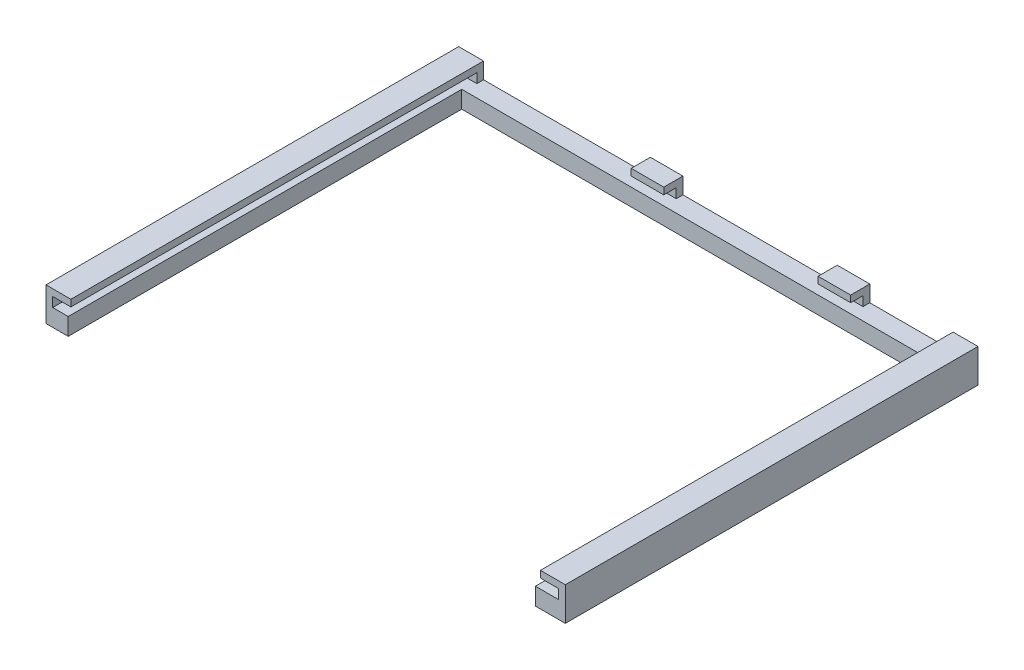
ISO-10303-21;
HEADER;
FILE_DESCRIPTION(('STEP AP214'),'2;1');
FILE_NAME('part.step','',(''),(''),'','','');
FILE_SCHEMA(('AUTOMOTIVE_DESIGN { 1 0 10303 214 1 1 1 1 }'));
ENDSEC;
DATA;
#1=APPLICATION_CONTEXT('core data for automotive mechanical design processes');
#2=APPLICATION_PROTOCOL_DEFINITION('international standard','automotive_design',2000,#1);
#3=PRODUCT_CONTEXT('',#1,'mechanical');
#4=PRODUCT('Part','Part','',(#3));
#5=PRODUCT_RELATED_PRODUCT_CATEGORY('part','',(#4));
#6=PRODUCT_DEFINITION_FORMATION('','',#4);
#7=PRODUCT_DEFINITION_CONTEXT('part definition',#1,'design');
#8=PRODUCT_DEFINITION('design','',#6,#7);
#9=PRODUCT_DEFINITION_SHAPE('','',#8);
#10=(LENGTH_UNIT() NAMED_UNIT(*) SI_UNIT(.MILLI.,.METRE.));
#11=(NAMED_UNIT(*) PLANE_ANGLE_UNIT() SI_UNIT($,.RADIAN.));
#12=(NAMED_UNIT(*) SI_UNIT($,.STERADIAN.) SOLID_ANGLE_UNIT());
#13=UNCERTAINTY_MEASURE_WITH_UNIT(LENGTH_MEASURE(1.E-05),#10,'distance_accuracy_value','');
#14=(GEOMETRIC_REPRESENTATION_CONTEXT(3) GLOBAL_UNCERTAINTY_ASSIGNED_CONTEXT((#13)) GLOBAL_UNIT_ASSIGNED_CONTEXT((#10,
#11,#12)) REPRESENTATION_CONTEXT('',''));
#15=CARTESIAN_POINT('',(0.,0.,0.));
#16=DIRECTION('',(0.,0.,1.));
#17=DIRECTION('',(1.,0.,0.));
#18=AXIS2_PLACEMENT_3D('',#15,#16,#17);
#19=CARTESIAN_POINT('',(0.,0.,0.));
#20=DIRECTION('',(0.,0.,1.));
#21=DIRECTION('',(1.,0.,0.));
#22=AXIS2_PLACEMENT_3D('',#19,#20,#21);
#23=PLANE('',#22);
#24=DIRECTION('',(0.,1.,0.));
#25=VECTOR('',#24,1.);
#26=CARTESIAN_POINT('',(59.9851758888026,0.,0.));
#27=LINE('',#26,#25);
#28=CARTESIAN_POINT('',(59.9851758888026,-31.2089574155654,0.));
#29=VERTEX_POINT('',#28);
#30=CARTESIAN_POINT('',(59.9851758888026,-26.7089574155654,0.));
#31=VERTEX_POINT('',#30);
#32=EDGE_CURVE('E11',#29,#31,#27,.T.);
#33=ORIENTED_EDGE('',*,*,#32,.F.);
#34=DIRECTION('',(1.,0.,0.));
#35=VECTOR('',#34,1.);
#36=CARTESIAN_POINT('',(-67.8,-31.2089574155654,0.));
#37=LINE('',#36,#35);
#38=CARTESIAN_POINT('',(67.8,-31.2089574155654,0.));
#39=VERTEX_POINT('',#38);
#40=EDGE_CURVE('E486',#29,#39,#37,.T.);
#41=ORIENTED_EDGE('',*,*,#40,.T.);
#42=DIRECTION('',(0.,1.,0.));
#43=VECTOR('',#42,1.);
#44=CARTESIAN_POINT('',(67.8,-31.2089574155654,0.));
#45=LINE('',#44,#43);
#46=CARTESIAN_POINT('',(67.8,-22.4589574155654,0.));
#47=VERTEX_POINT('',#46);
#48=EDGE_CURVE('E491',#39,#47,#45,.T.);
#49=ORIENTED_EDGE('',*,*,#48,.T.);
#50=DIRECTION('',(-1.,0.,0.));
#51=VECTOR('',#50,1.);
#52=CARTESIAN_POINT('',(67.8,-22.4589574155654,0.));
#53=LINE('',#52,#51);
#54=CARTESIAN_POINT('',(61.3,-22.4589574155653,0.));
#55=VERTEX_POINT('',#54);
#56=EDGE_CURVE('E495',#47,#55,#53,.T.);
#57=ORIENTED_EDGE('',*,*,#56,.T.);
#58=DIRECTION('',(0.,-1.,0.));
#59=VECTOR('',#58,1.);
#60=CARTESIAN_POINT('',(61.3,-22.4589574155653,0.));
#61=LINE('',#60,#59);
#62=CARTESIAN_POINT('',(61.3,-24.2089574155654,0.));
#63=VERTEX_POINT('',#62);
#64=EDGE_CURVE('E499',#55,#63,#61,.T.);
#65=ORIENTED_EDGE('',*,*,#64,.T.);
#66=DIRECTION('',(1.,0.,0.));
#67=VECTOR('',#66,1.);
#68=CARTESIAN_POINT('',(61.3,-24.2089574155654,0.));
#69=LINE('',#68,#67);
#70=CARTESIAN_POINT('',(66.05,-24.2089574155654,0.));
#71=VERTEX_POINT('',#70);
#72=EDGE_CURVE('E503',#63,#71,#69,.T.);
#73=ORIENTED_EDGE('',*,*,#72,.T.);
#74=DIRECTION('',(0.,-1.,0.));
#75=VECTOR('',#74,1.);
#76=CARTESIAN_POINT('',(66.05,-24.2089574155654,0.));
#77=LINE('',#76,#75);
#78=CARTESIAN_POINT('',(66.05,-26.7089574155654,0.));
#79=VERTEX_POINT('',#78);
#80=EDGE_CURVE('E507',#71,#79,#77,.T.);
#81=ORIENTED_EDGE('',*,*,#80,.T.);
#82=DIRECTION('',(-1.,0.,0.));
#83=VECTOR('',#82,1.);
#84=CARTESIAN_POINT('',(66.05,-26.7089574155654,0.));
#85=LINE('',#84,#83);
#86=EDGE_CURVE('E512',#79,#31,#85,.T.);
#87=ORIENTED_EDGE('',*,*,#86,.T.);
#88=EDGE_LOOP('',(#33,#41,#49,#57,#65,#73,#81,#87));
#89=FACE_BOUND('',#88,.T.);
#90=ADVANCED_FACE('F45',(#89),#23,.T.);
#91=CARTESIAN_POINT('',(66.05,-26.7089574155654,-107.75));
#92=DIRECTION('',(0.,1.,0.));
#93=DIRECTION('',(-1.,0.,0.));
#94=AXIS2_PLACEMENT_3D('',#91,#92,#93);
#95=PLANE('',#94);
#96=DIRECTION('',(0.,0.,1.));
#97=VECTOR('',#96,1.);
#98=CARTESIAN_POINT('',(59.9851758888026,-26.7089574155654,4.1474286698367));
#99=LINE('',#98,#97);
#100=CARTESIAN_POINT('',(59.9851758888026,-26.7089574155654,-102.75));
#101=VERTEX_POINT('',#100);
#102=EDGE_CURVE('E243',#101,#31,#99,.T.);
#103=ORIENTED_EDGE('',*,*,#102,.T.);
#104=ORIENTED_EDGE('',*,*,#86,.F.);
#105=DIRECTION('',(0.,0.,1.));
#106=VECTOR('',#105,1.);
#107=CARTESIAN_POINT('',(66.05,-26.7089574155654,-107.75));
#108=LINE('',#107,#106);
#109=CARTESIAN_POINT('',(66.05,-26.7089574155654,-106.));
#110=VERTEX_POINT('',#109);
#111=EDGE_CURVE('E525',#110,#79,#108,.T.);
#112=ORIENTED_EDGE('',*,*,#111,.F.);
#113=DIRECTION('',(1.,0.,0.));
#114=VECTOR('',#113,1.);
#115=CARTESIAN_POINT('',(58.248361096067,-26.7089574155648,-106.));
#116=LINE('',#115,#114);
#117=CARTESIAN_POINT('',(61.3,-26.7089574155654,-106.));
#118=VERTEX_POINT('',#117);
#119=EDGE_CURVE('E289',#118,#110,#116,.T.);
#120=ORIENTED_EDGE('',*,*,#119,.F.);
#121=DIRECTION('',(0.,0.,1.));
#122=VECTOR('',#121,1.);
#123=CARTESIAN_POINT('',(61.3,-26.7089574155648,-107.75));
#124=LINE('',#123,#122);
#125=CARTESIAN_POINT('',(61.3,-26.7089574155654,-107.75));
#126=VERTEX_POINT('',#125);
#127=EDGE_CURVE('E307',#126,#118,#124,.T.);
#128=ORIENTED_EDGE('',*,*,#127,.F.);
#129=DIRECTION('',(-1.,0.,0.));
#130=VECTOR('',#129,1.);
#131=CARTESIAN_POINT('',(66.05,-26.7089574155654,-107.75));
#132=LINE('',#131,#130);
#133=CARTESIAN_POINT('',(39.55,-26.7089574155654,-107.75));
#134=VERTEX_POINT('',#133);
#135=EDGE_CURVE('E466',#126,#134,#132,.T.);
#136=ORIENTED_EDGE('',*,*,#135,.T.);
#137=DIRECTION('',(0.,0.,-1.));
#138=VECTOR('',#137,1.);
#139=CARTESIAN_POINT('',(39.55,-26.7089574155654,-107.75));
#140=LINE('',#139,#138);
#141=CARTESIAN_POINT('',(39.55,-26.7089574155654,-106.));
#142=VERTEX_POINT('',#141);
#143=EDGE_CURVE('E380',#142,#134,#140,.T.);
#144=ORIENTED_EDGE('',*,*,#143,.F.);
#145=DIRECTION('',(1.,0.,0.));
#146=VECTOR('',#145,1.);
#147=CARTESIAN_POINT('',(31.05,-26.7089574155654,-106.));
#148=LINE('',#147,#146);
#149=CARTESIAN_POINT('',(31.05,-26.7089574155654,-106.));
#150=VERTEX_POINT('',#149);
#151=EDGE_CURVE('E358',#150,#142,#148,.T.);
#152=ORIENTED_EDGE('',*,*,#151,.F.);
#153=DIRECTION('',(0.,0.,1.));
#154=VECTOR('',#153,1.);
#155=CARTESIAN_POINT('',(31.05,-26.7089574155654,-107.75));
#156=LINE('',#155,#154);
#157=CARTESIAN_POINT('',(31.05,-26.7089574155654,-107.75));
#158=VERTEX_POINT('',#157);
#159=EDGE_CURVE('E384',#158,#150,#156,.T.);
#160=ORIENTED_EDGE('',*,*,#159,.F.);
#161=CARTESIAN_POINT('',(-9.24999999999999,-26.7089574155654,-107.75));
#162=VERTEX_POINT('',#161);
#163=EDGE_CURVE('E470',#158,#162,#132,.T.);
#164=ORIENTED_EDGE('',*,*,#163,.T.);
#165=DIRECTION('',(0.,0.,-1.));
#166=VECTOR('',#165,1.);
#167=CARTESIAN_POINT('',(-9.25,-26.7089574155654,-107.75));
#168=LINE('',#167,#166);
#169=CARTESIAN_POINT('',(-9.25,-26.7089574155654,-106.));
#170=VERTEX_POINT('',#169);
#171=EDGE_CURVE('E406',#170,#162,#168,.T.);
#172=ORIENTED_EDGE('',*,*,#171,.F.);
#173=DIRECTION('',(1.,0.,0.));
#174=VECTOR('',#173,1.);
#175=CARTESIAN_POINT('',(-17.75,-26.7089574155654,-106.));
#176=LINE('',#175,#174);
#177=CARTESIAN_POINT('',(-17.75,-26.7089574155654,-106.));
#178=VERTEX_POINT('',#177);
#179=EDGE_CURVE('E320',#178,#170,#176,.T.);
#180=ORIENTED_EDGE('',*,*,#179,.F.);
#181=DIRECTION('',(0.,0.,1.));
#182=VECTOR('',#181,1.);
#183=CARTESIAN_POINT('',(-17.75,-26.7089574155654,-107.75));
#184=LINE('',#183,#182);
#185=CARTESIAN_POINT('',(-17.75,-26.7089574155654,-107.75));
#186=VERTEX_POINT('',#185);
#187=EDGE_CURVE('E389',#186,#178,#184,.T.);
#188=ORIENTED_EDGE('',*,*,#187,.F.);
#189=CARTESIAN_POINT('',(-61.3,-26.7089574155654,-107.75));
#190=VERTEX_POINT('',#189);
#191=EDGE_CURVE('E465',#186,#190,#132,.T.);
#192=ORIENTED_EDGE('',*,*,#191,.T.);
#193=DIRECTION('',(0.,0.,-1.));
#194=VECTOR('',#193,1.);
#195=CARTESIAN_POINT('',(-61.3,-26.7089574155654,-107.75));
#196=LINE('',#195,#194);
#197=CARTESIAN_POINT('',(-61.3,-26.7089574155654,-106.));
#198=VERTEX_POINT('',#197);
#199=EDGE_CURVE('E69',#198,#190,#196,.T.);
#200=ORIENTED_EDGE('',*,*,#199,.F.);
#201=DIRECTION('',(-1.,0.,0.));
#202=VECTOR('',#201,1.);
#203=CARTESIAN_POINT('',(-58.2483610960666,-26.7089574155654,-106.));
#204=LINE('',#203,#202);
#205=CARTESIAN_POINT('',(-66.05,-26.7089574155654,-106.));
#206=VERTEX_POINT('',#205);
#207=EDGE_CURVE('E284',#198,#206,#204,.T.);
#208=ORIENTED_EDGE('',*,*,#207,.T.);
#209=DIRECTION('',(0.,0.,1.));
#210=VECTOR('',#209,1.);
#211=CARTESIAN_POINT('',(-66.05,-26.7089574155654,-107.75));
#212=LINE('',#211,#210);
#213=CARTESIAN_POINT('',(-66.05,-26.7089574155654,0.));
#214=VERTEX_POINT('',#213);
#215=EDGE_CURVE('E521',#206,#214,#212,.T.);
#216=ORIENTED_EDGE('',*,*,#215,.T.);
#217=CARTESIAN_POINT('',(-62.,-26.7089574155654,0.));
#218=VERTEX_POINT('',#217);
#219=EDGE_CURVE('E511',#218,#214,#85,.T.);
#220=ORIENTED_EDGE('',*,*,#219,.F.);
#221=DIRECTION('',(0.,0.,-1.));
#222=VECTOR('',#221,1.);
#223=CARTESIAN_POINT('',(-62.,-26.7089574155654,4.1474286698367));
#224=LINE('',#223,#222);
#225=CARTESIAN_POINT('',(-62.,-26.7089574155654,-102.75));
#226=VERTEX_POINT('',#225);
#227=EDGE_CURVE('E61',#218,#226,#224,.T.);
#228=ORIENTED_EDGE('',*,*,#227,.T.);
#229=DIRECTION('',(1.,0.,0.));
#230=VECTOR('',#229,1.);
#231=CARTESIAN_POINT('',(-62.,-26.7089574155654,-102.75));
#232=LINE('',#231,#230);
#233=EDGE_CURVE('E257',#226,#101,#232,.T.);
#234=ORIENTED_EDGE('',*,*,#233,.T.);
#235=EDGE_LOOP('',(#103,#104,#112,#120,#128,#136,#144,#152,#160,#164,#172,#180,#188,#192,#200,
#208,#216,#220,#228,#234));
#236=FACE_BOUND('',#235,.T.);
#237=ADVANCED_FACE('F263',(#236),#95,.T.);
#238=CARTESIAN_POINT('',(-66.05,-24.2089574155654,-107.75));
#239=DIRECTION('',(0.,-1.,0.));
#240=DIRECTION('',(0.,0.,-1.));
#241=AXIS2_PLACEMENT_3D('',#238,#239,#240);
#242=PLANE('',#241);
#243=DIRECTION('',(0.,0.,1.));
#244=VECTOR('',#243,1.);
#245=CARTESIAN_POINT('',(-66.05,-24.2089574155654,-107.75));
#246=LINE('',#245,#244);
#247=CARTESIAN_POINT('',(-66.05,-24.2089574155654,-106.));
#248=VERTEX_POINT('',#247);
#249=CARTESIAN_POINT('',(-66.05,-24.2089574155654,0.));
#250=VERTEX_POINT('',#249);
#251=EDGE_CURVE('E518',#248,#250,#246,.T.);
#252=ORIENTED_EDGE('',*,*,#251,.F.);
#253=DIRECTION('',(-1.,0.,0.));
#254=VECTOR('',#253,1.);
#255=CARTESIAN_POINT('',(-58.2483610960666,-24.2089574155654,-106.));
#256=LINE('',#255,#254);
#257=CARTESIAN_POINT('',(-61.3,-24.2089574155654,-106.));
#258=VERTEX_POINT('',#257);
#259=EDGE_CURVE('E279',#258,#248,#256,.T.);
#260=ORIENTED_EDGE('',*,*,#259,.F.);
#261=DIRECTION('',(0.,0.,1.));
#262=VECTOR('',#261,1.);
#263=CARTESIAN_POINT('',(-61.3,-24.2089574155654,-107.75));
#264=LINE('',#263,#262);
#265=CARTESIAN_POINT('',(-61.3,-24.2089574155654,0.));
#266=VERTEX_POINT('',#265);
#267=EDGE_CURVE('E469',#258,#266,#264,.T.);
#268=ORIENTED_EDGE('',*,*,#267,.T.);
#269=DIRECTION('',(1.,0.,0.));
#270=VECTOR('',#269,1.);
#271=CARTESIAN_POINT('',(-66.05,-24.2089574155654,0.));
#272=LINE('',#271,#270);
#273=EDGE_CURVE('E436',#250,#266,#272,.T.);
#274=ORIENTED_EDGE('',*,*,#273,.F.);
#275=EDGE_LOOP('',(#252,#260,#268,#274));
#276=FACE_BOUND('',#275,.T.);
#277=ADVANCED_FACE('F47',(#276),#242,.T.);
#278=CARTESIAN_POINT('',(-66.05,-26.7089574155654,-107.75));
#279=DIRECTION('',(1.,0.,0.));
#280=DIRECTION('',(0.,0.,-1.));
#281=AXIS2_PLACEMENT_3D('',#278,#279,#280);
#282=PLANE('',#281);
#283=ORIENTED_EDGE('',*,*,#215,.F.);
#284=DIRECTION('',(0.,-1.,0.));
#285=VECTOR('',#284,1.);
#286=CARTESIAN_POINT('',(-66.05,-26.7089574155654,-106.));
#287=LINE('',#286,#285);
#288=EDGE_CURVE('E280',#248,#206,#287,.T.);
#289=ORIENTED_EDGE('',*,*,#288,.F.);
#290=ORIENTED_EDGE('',*,*,#251,.T.);
#291=DIRECTION('',(0.,1.,0.));
#292=VECTOR('',#291,1.);
#293=CARTESIAN_POINT('',(-66.05,-26.7089574155654,0.));
#294=LINE('',#293,#292);
#295=EDGE_CURVE('E442',#214,#250,#294,.T.);
#296=ORIENTED_EDGE('',*,*,#295,.F.);
#297=EDGE_LOOP('',(#283,#289,#290,#296));
#298=FACE_BOUND('',#297,.T.);
#299=ADVANCED_FACE('F624',(#298),#282,.T.);
#300=CARTESIAN_POINT('',(66.05,-24.2089574155654,-107.75));
#301=DIRECTION('',(-1.,0.,0.));
#302=DIRECTION('',(0.,0.,1.));
#303=AXIS2_PLACEMENT_3D('',#300,#301,#302);
#304=PLANE('',#303);
#305=DIRECTION('',(0.,0.,1.));
#306=VECTOR('',#305,1.);
#307=CARTESIAN_POINT('',(66.05,-24.2089574155654,-107.75));
#308=LINE('',#307,#306);
#309=CARTESIAN_POINT('',(66.05,-24.2089574155654,-106.));
#310=VERTEX_POINT('',#309);
#311=EDGE_CURVE('E528',#310,#71,#308,.T.);
#312=ORIENTED_EDGE('',*,*,#311,.F.);
#313=DIRECTION('',(0.,1.,0.));
#314=VECTOR('',#313,1.);
#315=CARTESIAN_POINT('',(66.0499999999998,-26.7089574155648,-106.));
#316=LINE('',#315,#314);
#317=EDGE_CURVE('E297',#110,#310,#316,.T.);
#318=ORIENTED_EDGE('',*,*,#317,.F.);
#319=ORIENTED_EDGE('',*,*,#111,.T.);
#320=ORIENTED_EDGE('',*,*,#80,.F.);
#321=EDGE_LOOP('',(#312,#318,#319,#320));
#322=FACE_BOUND('',#321,.T.);
#323=ADVANCED_FACE('F853',(#322),#304,.T.);
#324=CARTESIAN_POINT('',(61.3,-24.2089574155654,-107.75));
#325=DIRECTION('',(0.,-1.,0.));
#326=DIRECTION('',(1.,0.,0.));
#327=AXIS2_PLACEMENT_3D('',#324,#325,#326);
#328=PLANE('',#327);
#329=DIRECTION('',(0.,0.,1.));
#330=VECTOR('',#329,1.);
#331=CARTESIAN_POINT('',(61.3,-24.2089574155654,-107.75));
#332=LINE('',#331,#330);
#333=CARTESIAN_POINT('',(61.3,-24.2089574155654,-106.));
#334=VERTEX_POINT('',#333);
#335=EDGE_CURVE('E531',#334,#63,#332,.T.);
#336=ORIENTED_EDGE('',*,*,#335,.F.);
#337=DIRECTION('',(1.,0.,0.));
#338=VECTOR('',#337,1.);
#339=CARTESIAN_POINT('',(58.248361096067,-24.2089574155653,-106.));
#340=LINE('',#339,#338);
#341=EDGE_CURVE('E301',#334,#310,#340,.T.);
#342=ORIENTED_EDGE('',*,*,#341,.T.);
#343=ORIENTED_EDGE('',*,*,#311,.T.);
#344=ORIENTED_EDGE('',*,*,#72,.F.);
#345=EDGE_LOOP('',(#336,#342,#343,#344));
#346=FACE_BOUND('',#345,.T.);
#347=ADVANCED_FACE('F848',(#346),#328,.T.);
#348=CARTESIAN_POINT('',(61.3,-22.4589574155653,-107.75));
#349=DIRECTION('',(-1.,0.,0.));
#350=DIRECTION('',(0.,0.,1.));
#351=AXIS2_PLACEMENT_3D('',#348,#349,#350);
#352=PLANE('',#351);
#353=ORIENTED_EDGE('',*,*,#64,.F.);
#354=DIRECTION('',(0.,0.,1.));
#355=VECTOR('',#354,1.);
#356=CARTESIAN_POINT('',(61.3,-22.4589574155653,-107.75));
#357=LINE('',#356,#355);
#358=CARTESIAN_POINT('',(61.3,-22.4589574155653,-107.75));
#359=VERTEX_POINT('',#358);
#360=EDGE_CURVE('E534',#359,#55,#357,.T.);
#361=ORIENTED_EDGE('',*,*,#360,.F.);
#362=DIRECTION('',(0.,-1.,0.));
#363=VECTOR('',#362,1.);
#364=CARTESIAN_POINT('',(61.3,-22.4589574155653,-107.75));
#365=LINE('',#364,#363);
#366=EDGE_CURVE('E462',#359,#126,#365,.T.);
#367=ORIENTED_EDGE('',*,*,#366,.T.);
#368=ORIENTED_EDGE('',*,*,#127,.T.);
#369=DIRECTION('',(0.,1.,0.));
#370=VECTOR('',#369,1.);
#371=CARTESIAN_POINT('',(61.3,-26.7089574155648,-106.));
#372=LINE('',#371,#370);
#373=EDGE_CURVE('E302',#118,#334,#372,.T.);
#374=ORIENTED_EDGE('',*,*,#373,.T.);
#375=ORIENTED_EDGE('',*,*,#335,.T.);
#376=EDGE_LOOP('',(#353,#361,#367,#368,#374,#375));
#377=FACE_BOUND('',#376,.T.);
#378=ADVANCED_FACE('F852',(#377),#352,.T.);
#379=CARTESIAN_POINT('',(67.8,-22.4589574155654,-107.75));
#380=DIRECTION('',(0.,1.,0.));
#381=DIRECTION('',(-1.,0.,0.));
#382=AXIS2_PLACEMENT_3D('',#379,#380,#381);
#383=PLANE('',#382);
#384=ORIENTED_EDGE('',*,*,#56,.F.);
#385=DIRECTION('',(0.,0.,1.));
#386=VECTOR('',#385,1.);
#387=CARTESIAN_POINT('',(67.8,-22.4589574155654,-107.75));
#388=LINE('',#387,#386);
#389=CARTESIAN_POINT('',(67.8,-22.4589574155654,-107.75));
#390=VERTEX_POINT('',#389);
#391=EDGE_CURVE('E537',#390,#47,#388,.T.);
#392=ORIENTED_EDGE('',*,*,#391,.F.);
#393=DIRECTION('',(-1.,0.,0.));
#394=VECTOR('',#393,1.);
#395=CARTESIAN_POINT('',(67.8,-22.4589574155654,-107.75));
#396=LINE('',#395,#394);
#397=EDGE_CURVE('E458',#390,#359,#396,.T.);
#398=ORIENTED_EDGE('',*,*,#397,.T.);
#399=ORIENTED_EDGE('',*,*,#360,.T.);
#400=EDGE_LOOP('',(#384,#392,#398,#399));
#401=FACE_BOUND('',#400,.T.);
#402=ADVANCED_FACE('F890',(#401),#383,.T.);
#403=CARTESIAN_POINT('',(67.8,-31.2089574155654,-107.75));
#404=DIRECTION('',(1.,0.,0.));
#405=DIRECTION('',(0.,0.,-1.));
#406=AXIS2_PLACEMENT_3D('',#403,#404,#405);
#407=PLANE('',#406);
#408=ORIENTED_EDGE('',*,*,#48,.F.);
#409=DIRECTION('',(0.,0.,1.));
#410=VECTOR('',#409,1.);
#411=CARTESIAN_POINT('',(67.8,-31.2089574155654,-107.75));
#412=LINE('',#411,#410);
#413=CARTESIAN_POINT('',(67.8,-31.2089574155654,-107.75));
#414=VERTEX_POINT('',#413);
#415=EDGE_CURVE('E540',#414,#39,#412,.T.);
#416=ORIENTED_EDGE('',*,*,#415,.F.);
#417=DIRECTION('',(0.,1.,0.));
#418=VECTOR('',#417,1.);
#419=CARTESIAN_POINT('',(67.8,-31.2089574155654,-107.75));
#420=LINE('',#419,#418);
#421=EDGE_CURVE('E454',#414,#390,#420,.T.);
#422=ORIENTED_EDGE('',*,*,#421,.T.);
#423=ORIENTED_EDGE('',*,*,#391,.T.);
#424=EDGE_LOOP('',(#408,#416,#422,#423));
#425=FACE_BOUND('',#424,.T.);
#426=ADVANCED_FACE('F577',(#425),#407,.T.);
#427=CARTESIAN_POINT('',(-67.8,-31.2089574155654,-107.75));
#428=DIRECTION('',(0.,-1.,0.));
#429=DIRECTION('',(0.,0.,-1.));
#430=AXIS2_PLACEMENT_3D('',#427,#428,#429);
#431=PLANE('',#430);
#432=DIRECTION('',(0.,0.,1.));
#433=VECTOR('',#432,1.);
#434=CARTESIAN_POINT('',(59.9851758888026,-31.2089574155654,4.1474286698367));
#435=LINE('',#434,#433);
#436=CARTESIAN_POINT('',(59.9851758888026,-31.2089574155654,-102.75));
#437=VERTEX_POINT('',#436);
#438=EDGE_CURVE('E266',#437,#29,#435,.T.);
#439=ORIENTED_EDGE('',*,*,#438,.F.);
#440=DIRECTION('',(1.,0.,0.));
#441=VECTOR('',#440,1.);
#442=CARTESIAN_POINT('',(-62.,-31.2089574155654,-102.75));
#443=LINE('',#442,#441);
#444=CARTESIAN_POINT('',(-62.,-31.2089574155654,-102.75));
#445=VERTEX_POINT('',#444);
#446=EDGE_CURVE('E259',#445,#437,#443,.T.);
#447=ORIENTED_EDGE('',*,*,#446,.F.);
#448=DIRECTION('',(0.,0.,-1.));
#449=VECTOR('',#448,1.);
#450=CARTESIAN_POINT('',(-62.,-31.2089574155654,4.1474286698367));
#451=LINE('',#450,#449);
#452=CARTESIAN_POINT('',(-62.,-31.2089574155654,0.));
#453=VERTEX_POINT('',#452);
#454=EDGE_CURVE('E272',#453,#445,#451,.T.);
#455=ORIENTED_EDGE('',*,*,#454,.F.);
#456=CARTESIAN_POINT('',(-67.8,-31.2089574155654,0.));
#457=VERTEX_POINT('',#456);
#458=EDGE_CURVE('E487',#457,#453,#37,.T.);
#459=ORIENTED_EDGE('',*,*,#458,.F.);
#460=DIRECTION('',(0.,0.,1.));
#461=VECTOR('',#460,1.);
#462=CARTESIAN_POINT('',(-67.8,-31.2089574155654,-107.75));
#463=LINE('',#462,#461);
#464=CARTESIAN_POINT('',(-67.8,-31.2089574155654,-107.75));
#465=VERTEX_POINT('',#464);
#466=EDGE_CURVE('E544',#465,#457,#463,.T.);
#467=ORIENTED_EDGE('',*,*,#466,.F.);
#468=DIRECTION('',(1.,0.,0.));
#469=VECTOR('',#468,1.);
#470=CARTESIAN_POINT('',(-67.8,-31.2089574155654,-107.75));
#471=LINE('',#470,#469);
#472=EDGE_CURVE('E450',#465,#414,#471,.T.);
#473=ORIENTED_EDGE('',*,*,#472,.T.);
#474=ORIENTED_EDGE('',*,*,#415,.T.);
#475=ORIENTED_EDGE('',*,*,#40,.F.);
#476=EDGE_LOOP('',(#439,#447,#455,#459,#467,#473,#474,#475));
#477=FACE_BOUND('',#476,.T.);
#478=ADVANCED_FACE('F560',(#477),#431,.T.);
#479=CARTESIAN_POINT('',(-67.8,-22.4589574155654,-107.75));
#480=DIRECTION('',(-1.,0.,0.));
#481=DIRECTION('',(0.,0.,1.));
#482=AXIS2_PLACEMENT_3D('',#479,#480,#481);
#483=PLANE('',#482);
#484=DIRECTION('',(0.,-1.,0.));
#485=VECTOR('',#484,1.);
#486=CARTESIAN_POINT('',(-67.8,-22.4589574155654,0.));
#487=LINE('',#486,#485);
#488=CARTESIAN_POINT('',(-67.8,-22.4589574155654,0.));
#489=VERTEX_POINT('',#488);
#490=EDGE_CURVE('E482',#489,#457,#487,.T.);
#491=ORIENTED_EDGE('',*,*,#490,.F.);
#492=DIRECTION('',(0.,0.,1.));
#493=VECTOR('',#492,1.);
#494=CARTESIAN_POINT('',(-67.8,-22.4589574155654,-107.75));
#495=LINE('',#494,#493);
#496=CARTESIAN_POINT('',(-67.8,-22.4589574155654,-107.75));
#497=VERTEX_POINT('',#496);
#498=EDGE_CURVE('E547',#497,#489,#495,.T.);
#499=ORIENTED_EDGE('',*,*,#498,.F.);
#500=DIRECTION('',(0.,-1.,0.));
#501=VECTOR('',#500,1.);
#502=CARTESIAN_POINT('',(-67.8,-22.4589574155654,-107.75));
#503=LINE('',#502,#501);
#504=EDGE_CURVE('E446',#497,#465,#503,.T.);
#505=ORIENTED_EDGE('',*,*,#504,.T.);
#506=ORIENTED_EDGE('',*,*,#466,.T.);
#507=EDGE_LOOP('',(#491,#499,#505,#506));
#508=FACE_BOUND('',#507,.T.);
#509=ADVANCED_FACE('F566',(#508),#483,.T.);
#510=CARTESIAN_POINT('',(-61.3,-22.4589574155653,-107.75));
#511=DIRECTION('',(0.,1.,0.));
#512=DIRECTION('',(-1.,0.,0.));
#513=AXIS2_PLACEMENT_3D('',#510,#511,#512);
#514=PLANE('',#513);
#515=DIRECTION('',(-1.,0.,0.));
#516=VECTOR('',#515,1.);
#517=CARTESIAN_POINT('',(-61.3,-22.4589574155653,0.));
#518=LINE('',#517,#516);
#519=CARTESIAN_POINT('',(-61.3,-22.4589574155653,0.));
#520=VERTEX_POINT('',#519);
#521=EDGE_CURVE('E478',#520,#489,#518,.T.);
#522=ORIENTED_EDGE('',*,*,#521,.F.);
#523=DIRECTION('',(0.,0.,1.));
#524=VECTOR('',#523,1.);
#525=CARTESIAN_POINT('',(-61.3,-22.4589574155653,-107.75));
#526=LINE('',#525,#524);
#527=CARTESIAN_POINT('',(-61.3,-22.4589574155653,-107.75));
#528=VERTEX_POINT('',#527);
#529=EDGE_CURVE('E550',#528,#520,#526,.T.);
#530=ORIENTED_EDGE('',*,*,#529,.F.);
#531=DIRECTION('',(-1.,0.,0.));
#532=VECTOR('',#531,1.);
#533=CARTESIAN_POINT('',(-61.3,-22.4589574155653,-107.75));
#534=LINE('',#533,#532);
#535=EDGE_CURVE('E441',#528,#497,#534,.T.);
#536=ORIENTED_EDGE('',*,*,#535,.T.);
#537=ORIENTED_EDGE('',*,*,#498,.T.);
#538=EDGE_LOOP('',(#522,#530,#536,#537));
#539=FACE_BOUND('',#538,.T.);
#540=ADVANCED_FACE('F629',(#539),#514,.T.);
#541=CARTESIAN_POINT('',(-61.3,-24.2089574155654,-107.75));
#542=DIRECTION('',(1.,0.,0.));
#543=DIRECTION('',(0.,1.,0.));
#544=AXIS2_PLACEMENT_3D('',#541,#542,#543);
#545=PLANE('',#544);
#546=DIRECTION('',(0.,1.,0.));
#547=VECTOR('',#546,1.);
#548=CARTESIAN_POINT('',(-61.3,-24.2089574155654,0.));
#549=LINE('',#548,#547);
#550=EDGE_CURVE('E474',#266,#520,#549,.T.);
#551=ORIENTED_EDGE('',*,*,#550,.F.);
#552=ORIENTED_EDGE('',*,*,#267,.F.);
#553=DIRECTION('',(0.,-1.,0.));
#554=VECTOR('',#553,1.);
#555=CARTESIAN_POINT('',(-61.3,-26.7089574155653,-106.));
#556=LINE('',#555,#554);
#557=EDGE_CURVE('E285',#258,#198,#556,.T.);
#558=ORIENTED_EDGE('',*,*,#557,.T.);
#559=ORIENTED_EDGE('',*,*,#199,.T.);
#560=DIRECTION('',(0.,1.,0.));
#561=VECTOR('',#560,1.);
#562=CARTESIAN_POINT('',(-61.3,-24.2089574155654,-107.75));
#563=LINE('',#562,#561);
#564=EDGE_CURVE('E437',#190,#528,#563,.T.);
#565=ORIENTED_EDGE('',*,*,#564,.T.);
#566=ORIENTED_EDGE('',*,*,#529,.T.);
#567=EDGE_LOOP('',(#551,#552,#558,#559,#565,#566));
#568=FACE_BOUND('',#567,.T.);
#569=ADVANCED_FACE('F616',(#568),#545,.T.);
#570=CARTESIAN_POINT('',(0.,0.,-107.75));
#571=DIRECTION('',(0.,0.,1.));
#572=DIRECTION('',(1.,0.,0.));
#573=AXIS2_PLACEMENT_3D('',#570,#571,#572);
#574=PLANE('',#573);
#575=ORIENTED_EDGE('',*,*,#564,.F.);
#576=ORIENTED_EDGE('',*,*,#191,.F.);
#577=DIRECTION('',(0.,-1.,0.));
#578=VECTOR('',#577,1.);
#579=CARTESIAN_POINT('',(-17.75,-22.4589574155654,-107.75));
#580=LINE('',#579,#578);
#581=CARTESIAN_POINT('',(-17.75,-22.4589574155654,-107.75));
#582=VERTEX_POINT('',#581);
#583=EDGE_CURVE('E415',#582,#186,#580,.T.);
#584=ORIENTED_EDGE('',*,*,#583,.F.);
#585=DIRECTION('',(-1.,0.,0.));
#586=VECTOR('',#585,1.);
#587=CARTESIAN_POINT('',(-17.75,-22.4589574155654,-107.75));
#588=LINE('',#587,#586);
#589=CARTESIAN_POINT('',(-9.25,-22.4589574155654,-107.75));
#590=VERTEX_POINT('',#589);
#591=EDGE_CURVE('E412',#590,#582,#588,.T.);
#592=ORIENTED_EDGE('',*,*,#591,.F.);
#593=DIRECTION('',(0.,-1.,0.));
#594=VECTOR('',#593,1.);
#595=CARTESIAN_POINT('',(-9.25,-22.4589574155654,-107.75));
#596=LINE('',#595,#594);
#597=EDGE_CURVE('E424',#590,#162,#596,.T.);
#598=ORIENTED_EDGE('',*,*,#597,.T.);
#599=ORIENTED_EDGE('',*,*,#163,.F.);
#600=DIRECTION('',(0.,-1.,0.));
#601=VECTOR('',#600,1.);
#602=CARTESIAN_POINT('',(31.05,-22.4589574155654,-107.75));
#603=LINE('',#602,#601);
#604=CARTESIAN_POINT('',(31.05,-22.4589574155654,-107.75));
#605=VERTEX_POINT('',#604);
#606=EDGE_CURVE('E375',#605,#158,#603,.T.);
#607=ORIENTED_EDGE('',*,*,#606,.F.);
#608=DIRECTION('',(-1.,0.,0.));
#609=VECTOR('',#608,1.);
#610=CARTESIAN_POINT('',(31.05,-22.4589574155654,-107.75));
#611=LINE('',#610,#609);
#612=CARTESIAN_POINT('',(39.55,-22.4589574155654,-107.75));
#613=VERTEX_POINT('',#612);
#614=EDGE_CURVE('E379',#613,#605,#611,.T.);
#615=ORIENTED_EDGE('',*,*,#614,.F.);
#616=DIRECTION('',(0.,-1.,0.));
#617=VECTOR('',#616,1.);
#618=CARTESIAN_POINT('',(39.55,-22.4589574155654,-107.75));
#619=LINE('',#618,#617);
#620=EDGE_CURVE('E371',#613,#134,#619,.T.);
#621=ORIENTED_EDGE('',*,*,#620,.T.);
#622=ORIENTED_EDGE('',*,*,#135,.F.);
#623=ORIENTED_EDGE('',*,*,#366,.F.);
#624=ORIENTED_EDGE('',*,*,#397,.F.);
#625=ORIENTED_EDGE('',*,*,#421,.F.);
#626=ORIENTED_EDGE('',*,*,#472,.F.);
#627=ORIENTED_EDGE('',*,*,#504,.F.);
#628=ORIENTED_EDGE('',*,*,#535,.F.);
#629=EDGE_LOOP('',(#575,#576,#584,#592,#598,#599,#607,#615,#621,#622,#623,#624,#625,#626,#627,#628));
#630=FACE_BOUND('',#629,.T.);
#631=ADVANCED_FACE('F571',(#630),#574,.F.);
#632=DIRECTION('',(0.,-1.,0.));
#633=VECTOR('',#632,1.);
#634=CARTESIAN_POINT('',(-62.,0.,0.));
#635=LINE('',#634,#633);
#636=EDGE_CURVE('E54',#218,#453,#635,.T.);
#637=ORIENTED_EDGE('',*,*,#636,.F.);
#638=ORIENTED_EDGE('',*,*,#219,.T.);
#639=ORIENTED_EDGE('',*,*,#295,.T.);
#640=ORIENTED_EDGE('',*,*,#273,.T.);
#641=ORIENTED_EDGE('',*,*,#550,.T.);
#642=ORIENTED_EDGE('',*,*,#521,.T.);
#643=ORIENTED_EDGE('',*,*,#490,.T.);
#644=ORIENTED_EDGE('',*,*,#458,.T.);
#645=EDGE_LOOP('',(#637,#638,#639,#640,#641,#642,#643,#644));
#646=FACE_BOUND('',#645,.T.);
#647=ADVANCED_FACE('F562',(#646),#23,.T.);
#648=CARTESIAN_POINT('',(-17.75,-22.4589574155654,-107.75));
#649=DIRECTION('',(1.,0.,0.));
#650=DIRECTION('',(0.,0.,-1.));
#651=AXIS2_PLACEMENT_3D('',#648,#649,#650);
#652=PLANE('',#651);
#653=DIRECTION('',(0.,-1.,0.));
#654=VECTOR('',#653,1.);
#655=CARTESIAN_POINT('',(-17.75,-26.7089574155654,-106.));
#656=LINE('',#655,#654);
#657=CARTESIAN_POINT('',(-17.75,-24.2089574155654,-106.));
#658=VERTEX_POINT('',#657);
#659=EDGE_CURVE('E316',#658,#178,#656,.T.);
#660=ORIENTED_EDGE('',*,*,#659,.F.);
#661=DIRECTION('',(0.,0.,1.));
#662=VECTOR('',#661,1.);
#663=CARTESIAN_POINT('',(-17.75,-24.2089574155654,-106.));
#664=LINE('',#663,#662);
#665=CARTESIAN_POINT('',(-17.75,-24.2089574155654,-102.75));
#666=VERTEX_POINT('',#665);
#667=EDGE_CURVE('E335',#658,#666,#664,.T.);
#668=ORIENTED_EDGE('',*,*,#667,.T.);
#669=DIRECTION('',(0.,-1.,0.));
#670=VECTOR('',#669,1.);
#671=CARTESIAN_POINT('',(-17.75,-22.4589574155654,-102.75));
#672=LINE('',#671,#670);
#673=CARTESIAN_POINT('',(-17.75,-22.4589574155654,-102.75));
#674=VERTEX_POINT('',#673);
#675=EDGE_CURVE('E432',#674,#666,#672,.T.);
#676=ORIENTED_EDGE('',*,*,#675,.F.);
#677=DIRECTION('',(0.,0.,1.));
#678=VECTOR('',#677,1.);
#679=CARTESIAN_POINT('',(-17.75,-22.4589574155654,-107.75));
#680=LINE('',#679,#678);
#681=EDGE_CURVE('E401',#582,#674,#680,.T.);
#682=ORIENTED_EDGE('',*,*,#681,.F.);
#683=ORIENTED_EDGE('',*,*,#583,.T.);
#684=ORIENTED_EDGE('',*,*,#187,.T.);
#685=EDGE_LOOP('',(#660,#668,#676,#682,#683,#684));
#686=FACE_BOUND('',#685,.T.);
#687=ADVANCED_FACE('F606',(#686),#652,.F.);
#688=CARTESIAN_POINT('',(-17.75,-22.4589574155654,-102.75));
#689=DIRECTION('',(0.,0.,-1.));
#690=DIRECTION('',(-1.,0.,0.));
#691=AXIS2_PLACEMENT_3D('',#688,#689,#690);
#692=PLANE('',#691);
#693=ORIENTED_EDGE('',*,*,#675,.T.);
#694=DIRECTION('',(-1.,0.,0.));
#695=VECTOR('',#694,1.);
#696=CARTESIAN_POINT('',(-17.75,-24.2089574155654,-102.75));
#697=LINE('',#696,#695);
#698=CARTESIAN_POINT('',(-9.25,-24.2089574155654,-102.75));
#699=VERTEX_POINT('',#698);
#700=EDGE_CURVE('E321',#699,#666,#697,.T.);
#701=ORIENTED_EDGE('',*,*,#700,.F.);
#702=DIRECTION('',(0.,-1.,0.));
#703=VECTOR('',#702,1.);
#704=CARTESIAN_POINT('',(-9.25,-22.4589574155654,-102.75));
#705=LINE('',#704,#703);
#706=CARTESIAN_POINT('',(-9.25,-22.4589574155654,-102.75));
#707=VERTEX_POINT('',#706);
#708=EDGE_CURVE('E428',#707,#699,#705,.T.);
#709=ORIENTED_EDGE('',*,*,#708,.F.);
#710=DIRECTION('',(1.,0.,0.));
#711=VECTOR('',#710,1.);
#712=CARTESIAN_POINT('',(-17.75,-22.4589574155654,-102.75));
#713=LINE('',#712,#711);
#714=EDGE_CURVE('E405',#674,#707,#713,.T.);
#715=ORIENTED_EDGE('',*,*,#714,.F.);
#716=EDGE_LOOP('',(#693,#701,#709,#715));
#717=FACE_BOUND('',#716,.T.);
#718=ADVANCED_FACE('F609',(#717),#692,.F.);
#719=CARTESIAN_POINT('',(-9.25,-22.4589574155654,-107.75));
#720=DIRECTION('',(-1.,0.,0.));
#721=DIRECTION('',(0.,-1.,0.));
#722=AXIS2_PLACEMENT_3D('',#719,#720,#721);
#723=PLANE('',#722);
#724=ORIENTED_EDGE('',*,*,#708,.T.);
#725=DIRECTION('',(0.,0.,1.));
#726=VECTOR('',#725,1.);
#727=CARTESIAN_POINT('',(-9.25,-24.2089574155654,-106.));
#728=LINE('',#727,#726);
#729=CARTESIAN_POINT('',(-9.25,-24.2089574155654,-106.));
#730=VERTEX_POINT('',#729);
#731=EDGE_CURVE('E331',#730,#699,#728,.T.);
#732=ORIENTED_EDGE('',*,*,#731,.F.);
#733=DIRECTION('',(0.,1.,0.));
#734=VECTOR('',#733,1.);
#735=CARTESIAN_POINT('',(-9.25000000000001,-26.7089574155654,-106.));
#736=LINE('',#735,#734);
#737=EDGE_CURVE('E324',#170,#730,#736,.T.);
#738=ORIENTED_EDGE('',*,*,#737,.F.);
#739=ORIENTED_EDGE('',*,*,#171,.T.);
#740=ORIENTED_EDGE('',*,*,#597,.F.);
#741=DIRECTION('',(0.,0.,-1.));
#742=VECTOR('',#741,1.);
#743=CARTESIAN_POINT('',(-9.25,-22.4589574155654,-107.75));
#744=LINE('',#743,#742);
#745=EDGE_CURVE('E409',#707,#590,#744,.T.);
#746=ORIENTED_EDGE('',*,*,#745,.F.);
#747=EDGE_LOOP('',(#724,#732,#738,#739,#740,#746));
#748=FACE_BOUND('',#747,.T.);
#749=ADVANCED_FACE('F594',(#748),#723,.F.);
#750=CARTESIAN_POINT('',(0.,-22.4589574155654,0.));
#751=DIRECTION('',(0.,1.,0.));
#752=DIRECTION('',(0.,0.,1.));
#753=AXIS2_PLACEMENT_3D('',#750,#751,#752);
#754=PLANE('',#753);
#755=ORIENTED_EDGE('',*,*,#681,.T.);
#756=ORIENTED_EDGE('',*,*,#714,.T.);
#757=ORIENTED_EDGE('',*,*,#745,.T.);
#758=ORIENTED_EDGE('',*,*,#591,.T.);
#759=EDGE_LOOP('',(#755,#756,#757,#758));
#760=FACE_BOUND('',#759,.T.);
#761=ADVANCED_FACE('F612',(#760),#754,.T.);
#762=CARTESIAN_POINT('',(31.05,-22.4589574155654,-107.75));
#763=DIRECTION('',(1.,0.,0.));
#764=DIRECTION('',(0.,1.,0.));
#765=AXIS2_PLACEMENT_3D('',#762,#763,#764);
#766=PLANE('',#765);
#767=DIRECTION('',(0.,-1.,0.));
#768=VECTOR('',#767,1.);
#769=CARTESIAN_POINT('',(31.05,-26.7089574155654,-106.));
#770=LINE('',#769,#768);
#771=CARTESIAN_POINT('',(31.05,-24.2089574155654,-106.));
#772=VERTEX_POINT('',#771);
#773=EDGE_CURVE('E351',#772,#150,#770,.T.);
#774=ORIENTED_EDGE('',*,*,#773,.F.);
#775=DIRECTION('',(0.,0.,1.));
#776=VECTOR('',#775,1.);
#777=CARTESIAN_POINT('',(31.05,-24.2089574155654,-106.));
#778=LINE('',#777,#776);
#779=CARTESIAN_POINT('',(31.05,-24.2089574155654,-102.75));
#780=VERTEX_POINT('',#779);
#781=EDGE_CURVE('E306',#772,#780,#778,.T.);
#782=ORIENTED_EDGE('',*,*,#781,.T.);
#783=DIRECTION('',(0.,-1.,0.));
#784=VECTOR('',#783,1.);
#785=CARTESIAN_POINT('',(31.05,-22.4589574155654,-102.75));
#786=LINE('',#785,#784);
#787=CARTESIAN_POINT('',(31.05,-22.4589574155654,-102.75));
#788=VERTEX_POINT('',#787);
#789=EDGE_CURVE('E339',#788,#780,#786,.T.);
#790=ORIENTED_EDGE('',*,*,#789,.F.);
#791=DIRECTION('',(0.,0.,1.));
#792=VECTOR('',#791,1.);
#793=CARTESIAN_POINT('',(31.05,-22.4589574155654,-107.75));
#794=LINE('',#793,#792);
#795=EDGE_CURVE('E385',#605,#788,#794,.T.);
#796=ORIENTED_EDGE('',*,*,#795,.F.);
#797=ORIENTED_EDGE('',*,*,#606,.T.);
#798=ORIENTED_EDGE('',*,*,#159,.T.);
#799=EDGE_LOOP('',(#774,#782,#790,#796,#797,#798));
#800=FACE_BOUND('',#799,.T.);
#801=ADVANCED_FACE('F663',(#800),#766,.F.);
#802=CARTESIAN_POINT('',(31.05,-22.4589574155654,-102.75));
#803=DIRECTION('',(0.,0.,-1.));
#804=DIRECTION('',(-1.,0.,0.));
#805=AXIS2_PLACEMENT_3D('',#802,#803,#804);
#806=PLANE('',#805);
#807=ORIENTED_EDGE('',*,*,#789,.T.);
#808=DIRECTION('',(-1.,0.,0.));
#809=VECTOR('',#808,1.);
#810=CARTESIAN_POINT('',(31.05,-24.2089574155654,-102.75));
#811=LINE('',#810,#809);
#812=CARTESIAN_POINT('',(39.55,-24.2089574155654,-102.75));
#813=VERTEX_POINT('',#812);
#814=EDGE_CURVE('E334',#813,#780,#811,.T.);
#815=ORIENTED_EDGE('',*,*,#814,.F.);
#816=DIRECTION('',(0.,-1.,0.));
#817=VECTOR('',#816,1.);
#818=CARTESIAN_POINT('',(39.55,-22.4589574155654,-102.75));
#819=LINE('',#818,#817);
#820=CARTESIAN_POINT('',(39.55,-22.4589574155654,-102.75));
#821=VERTEX_POINT('',#820);
#822=EDGE_CURVE('E367',#821,#813,#819,.T.);
#823=ORIENTED_EDGE('',*,*,#822,.F.);
#824=DIRECTION('',(1.,0.,0.));
#825=VECTOR('',#824,1.);
#826=CARTESIAN_POINT('',(31.05,-22.4589574155654,-102.75));
#827=LINE('',#826,#825);
#828=EDGE_CURVE('E395',#788,#821,#827,.T.);
#829=ORIENTED_EDGE('',*,*,#828,.F.);
#830=EDGE_LOOP('',(#807,#815,#823,#829));
#831=FACE_BOUND('',#830,.T.);
#832=ADVANCED_FACE('F672',(#831),#806,.F.);
#833=CARTESIAN_POINT('',(39.55,-22.4589574155654,-107.75));
#834=DIRECTION('',(-1.,0.,0.));
#835=DIRECTION('',(0.,-1.,0.));
#836=AXIS2_PLACEMENT_3D('',#833,#834,#835);
#837=PLANE('',#836);
#838=ORIENTED_EDGE('',*,*,#822,.T.);
#839=DIRECTION('',(0.,0.,1.));
#840=VECTOR('',#839,1.);
#841=CARTESIAN_POINT('',(39.55,-24.2089574155654,-106.));
#842=LINE('',#841,#840);
#843=CARTESIAN_POINT('',(39.55,-24.2089574155654,-106.));
#844=VERTEX_POINT('',#843);
#845=EDGE_CURVE('E342',#844,#813,#842,.T.);
#846=ORIENTED_EDGE('',*,*,#845,.F.);
#847=DIRECTION('',(0.,1.,0.));
#848=VECTOR('',#847,1.);
#849=CARTESIAN_POINT('',(39.55,-26.7089574155654,-106.));
#850=LINE('',#849,#848);
#851=EDGE_CURVE('E355',#142,#844,#850,.T.);
#852=ORIENTED_EDGE('',*,*,#851,.F.);
#853=ORIENTED_EDGE('',*,*,#143,.T.);
#854=ORIENTED_EDGE('',*,*,#620,.F.);
#855=DIRECTION('',(0.,0.,-1.));
#856=VECTOR('',#855,1.);
#857=CARTESIAN_POINT('',(39.55,-22.4589574155654,-107.75));
#858=LINE('',#857,#856);
#859=EDGE_CURVE('E392',#821,#613,#858,.T.);
#860=ORIENTED_EDGE('',*,*,#859,.F.);
#861=EDGE_LOOP('',(#838,#846,#852,#853,#854,#860));
#862=FACE_BOUND('',#861,.T.);
#863=ADVANCED_FACE('F668',(#862),#837,.F.);
#864=CARTESIAN_POINT('',(0.,-22.4589574155653,0.));
#865=DIRECTION('',(0.,1.,0.));
#866=DIRECTION('',(-1.,0.,0.));
#867=AXIS2_PLACEMENT_3D('',#864,#865,#866);
#868=PLANE('',#867);
#869=ORIENTED_EDGE('',*,*,#795,.T.);
#870=ORIENTED_EDGE('',*,*,#828,.T.);
#871=ORIENTED_EDGE('',*,*,#859,.T.);
#872=ORIENTED_EDGE('',*,*,#614,.T.);
#873=EDGE_LOOP('',(#869,#870,#871,#872));
#874=FACE_BOUND('',#873,.T.);
#875=ADVANCED_FACE('F664',(#874),#868,.T.);
#876=CARTESIAN_POINT('',(31.05,-24.2089574155654,-106.));
#877=DIRECTION('',(0.,1.,0.));
#878=DIRECTION('',(0.,0.,1.));
#879=AXIS2_PLACEMENT_3D('',#876,#877,#878);
#880=PLANE('',#879);
#881=ORIENTED_EDGE('',*,*,#814,.T.);
#882=ORIENTED_EDGE('',*,*,#781,.F.);
#883=DIRECTION('',(-1.,0.,0.));
#884=VECTOR('',#883,1.);
#885=CARTESIAN_POINT('',(31.05,-24.2089574155654,-106.));
#886=LINE('',#885,#884);
#887=EDGE_CURVE('E345',#844,#772,#886,.T.);
#888=ORIENTED_EDGE('',*,*,#887,.F.);
#889=ORIENTED_EDGE('',*,*,#845,.T.);
#890=EDGE_LOOP('',(#881,#882,#888,#889));
#891=FACE_BOUND('',#890,.T.);
#892=ADVANCED_FACE('F667',(#891),#880,.F.);
#893=CARTESIAN_POINT('',(0.,0.,-106.));
#894=DIRECTION('',(0.,0.,-1.));
#895=DIRECTION('',(-1.,0.,0.));
#896=AXIS2_PLACEMENT_3D('',#893,#894,#895);
#897=PLANE('',#896);
#898=ORIENTED_EDGE('',*,*,#773,.T.);
#899=ORIENTED_EDGE('',*,*,#151,.T.);
#900=ORIENTED_EDGE('',*,*,#851,.T.);
#901=ORIENTED_EDGE('',*,*,#887,.T.);
#902=EDGE_LOOP('',(#898,#899,#900,#901));
#903=FACE_BOUND('',#902,.T.);
#904=ADVANCED_FACE('F680',(#903),#897,.F.);
#905=CARTESIAN_POINT('',(-17.75,-24.2089574155654,-106.));
#906=DIRECTION('',(0.,1.,0.));
#907=DIRECTION('',(0.,0.,1.));
#908=AXIS2_PLACEMENT_3D('',#905,#906,#907);
#909=PLANE('',#908);
#910=ORIENTED_EDGE('',*,*,#700,.T.);
#911=ORIENTED_EDGE('',*,*,#667,.F.);
#912=DIRECTION('',(-1.,0.,0.));
#913=VECTOR('',#912,1.);
#914=CARTESIAN_POINT('',(-17.75,-24.2089574155654,-106.));
#915=LINE('',#914,#913);
#916=EDGE_CURVE('E327',#730,#658,#915,.T.);
#917=ORIENTED_EDGE('',*,*,#916,.F.);
#918=ORIENTED_EDGE('',*,*,#731,.T.);
#919=EDGE_LOOP('',(#910,#911,#917,#918));
#920=FACE_BOUND('',#919,.T.);
#921=ADVANCED_FACE('F602',(#920),#909,.F.);
#922=CARTESIAN_POINT('',(0.,0.,-106.));
#923=DIRECTION('',(0.,0.,-1.));
#924=DIRECTION('',(-1.,0.,0.));
#925=AXIS2_PLACEMENT_3D('',#922,#923,#924);
#926=PLANE('',#925);
#927=ORIENTED_EDGE('',*,*,#659,.T.);
#928=ORIENTED_EDGE('',*,*,#179,.T.);
#929=ORIENTED_EDGE('',*,*,#737,.T.);
#930=ORIENTED_EDGE('',*,*,#916,.T.);
#931=EDGE_LOOP('',(#927,#928,#929,#930));
#932=FACE_BOUND('',#931,.T.);
#933=ADVANCED_FACE('F599',(#932),#926,.F.);
#934=CARTESIAN_POINT('',(58.248361096067,-26.7089574155648,-106.));
#935=DIRECTION('',(0.,0.,-1.));
#936=DIRECTION('',(-1.,0.,0.));
#937=AXIS2_PLACEMENT_3D('',#934,#935,#936);
#938=PLANE('',#937);
#939=ORIENTED_EDGE('',*,*,#373,.F.);
#940=ORIENTED_EDGE('',*,*,#119,.T.);
#941=ORIENTED_EDGE('',*,*,#317,.T.);
#942=ORIENTED_EDGE('',*,*,#341,.F.);
#943=EDGE_LOOP('',(#939,#940,#941,#942));
#944=FACE_BOUND('',#943,.T.);
#945=ADVANCED_FACE('F691',(#944),#938,.F.);
#946=CARTESIAN_POINT('',(-58.2483610960666,-26.7089574155654,-106.));
#947=DIRECTION('',(0.,0.,-1.));
#948=DIRECTION('',(-1.,0.,0.));
#949=AXIS2_PLACEMENT_3D('',#946,#947,#948);
#950=PLANE('',#949);
#951=ORIENTED_EDGE('',*,*,#557,.F.);
#952=ORIENTED_EDGE('',*,*,#259,.T.);
#953=ORIENTED_EDGE('',*,*,#288,.T.);
#954=ORIENTED_EDGE('',*,*,#207,.F.);
#955=EDGE_LOOP('',(#951,#952,#953,#954));
#956=FACE_BOUND('',#955,.T.);
#957=ADVANCED_FACE('F620',(#956),#950,.F.);
#958=CARTESIAN_POINT('',(-62.,135.48673732645,-102.75));
#959=DIRECTION('',(0.,0.,-1.));
#960=DIRECTION('',(-1.,0.,0.));
#961=AXIS2_PLACEMENT_3D('',#958,#959,#960);
#962=PLANE('',#961);
#963=DIRECTION('',(0.,-1.,0.));
#964=VECTOR('',#963,1.);
#965=CARTESIAN_POINT('',(-62.,135.48673732645,-102.75));
#966=LINE('',#965,#964);
#967=EDGE_CURVE('E275',#226,#445,#966,.T.);
#968=ORIENTED_EDGE('',*,*,#967,.T.);
#969=ORIENTED_EDGE('',*,*,#446,.T.);
#970=DIRECTION('',(0.,-1.,0.));
#971=VECTOR('',#970,1.);
#972=CARTESIAN_POINT('',(59.9851758888026,135.48673732645,-102.75));
#973=LINE('',#972,#971);
#974=EDGE_CURVE('E246',#101,#437,#973,.T.);
#975=ORIENTED_EDGE('',*,*,#974,.F.);
#976=ORIENTED_EDGE('',*,*,#233,.F.);
#977=EDGE_LOOP('',(#968,#969,#975,#976));
#978=FACE_BOUND('',#977,.T.);
#979=ADVANCED_FACE('F256',(#978),#962,.F.);
#980=CARTESIAN_POINT('',(59.9851758888026,135.48673732645,4.1474286698367));
#981=DIRECTION('',(1.,0.,0.));
#982=DIRECTION('',(0.,0.,-1.));
#983=AXIS2_PLACEMENT_3D('',#980,#981,#982);
#984=PLANE('',#983);
#985=ORIENTED_EDGE('',*,*,#32,.T.);
#986=ORIENTED_EDGE('',*,*,#102,.F.);
#987=ORIENTED_EDGE('',*,*,#974,.T.);
#988=ORIENTED_EDGE('',*,*,#438,.T.);
#989=EDGE_LOOP('',(#985,#986,#987,#988));
#990=FACE_BOUND('',#989,.T.);
#991=ADVANCED_FACE('F245',(#990),#984,.F.);
#992=CARTESIAN_POINT('',(-62.,135.48673732645,4.1474286698367));
#993=DIRECTION('',(-1.,0.,0.));
#994=DIRECTION('',(0.,0.,1.));
#995=AXIS2_PLACEMENT_3D('',#992,#993,#994);
#996=PLANE('',#995);
#997=ORIENTED_EDGE('',*,*,#636,.T.);
#998=ORIENTED_EDGE('',*,*,#454,.T.);
#999=ORIENTED_EDGE('',*,*,#967,.F.);
#1000=ORIENTED_EDGE('',*,*,#227,.F.);
#1001=EDGE_LOOP('',(#997,#998,#999,#1000));
#1002=FACE_BOUND('',#1001,.T.);
#1003=ADVANCED_FACE('F556',(#1002),#996,.F.);
#1004=CLOSED_SHELL('',(#90,#237,#277,#299,#323,#347,#378,#402,#426,#478,#509,#540,#569,#631,
#647,#687,#718,#749,#761,#801,#832,#863,#875,#892,#904,#921,#933,#945,#957,#979,#991,#1003));
#1005=MANIFOLD_SOLID_BREP('B2',#1004);
#1006=ADVANCED_BREP_SHAPE_REPRESENTATION('',(#18,#1005),#14);
#1007=SHAPE_DEFINITION_REPRESENTATION(#9,#1006);
ENDSEC;
END-ISO-10303-21;
